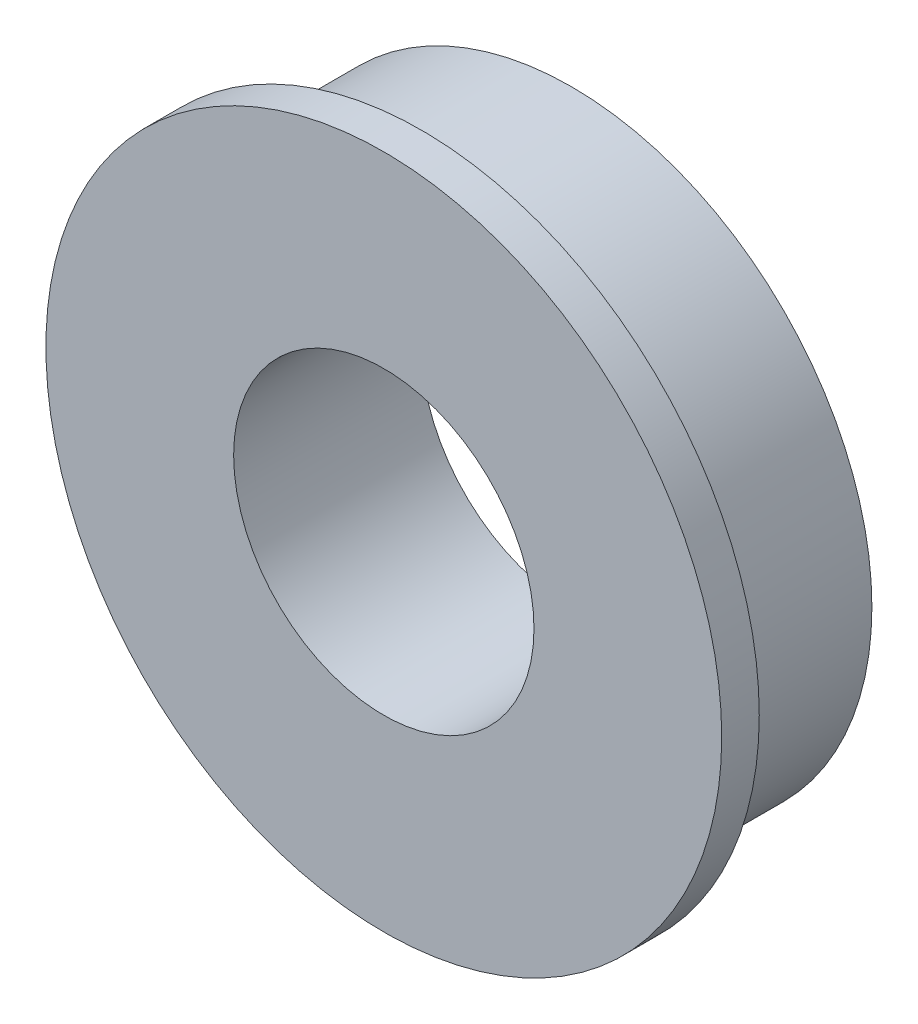
ISO-10303-21;
HEADER;
FILE_DESCRIPTION(('STEP AP214'),'2;1');
FILE_NAME('part.step','',(''),(''),'','','');
FILE_SCHEMA(('AUTOMOTIVE_DESIGN { 1 0 10303 214 1 1 1 1 }'));
ENDSEC;
DATA;
#1=APPLICATION_CONTEXT('core data for automotive mechanical design processes');
#2=APPLICATION_PROTOCOL_DEFINITION('international standard','automotive_design',2000,#1);
#3=PRODUCT_CONTEXT('',#1,'mechanical');
#4=PRODUCT('Part','Part','',(#3));
#5=PRODUCT_RELATED_PRODUCT_CATEGORY('part','',(#4));
#6=PRODUCT_DEFINITION_FORMATION('','',#4);
#7=PRODUCT_DEFINITION_CONTEXT('part definition',#1,'design');
#8=PRODUCT_DEFINITION('design','',#6,#7);
#9=PRODUCT_DEFINITION_SHAPE('','',#8);
#10=(LENGTH_UNIT() NAMED_UNIT(*) SI_UNIT(.MILLI.,.METRE.));
#11=(NAMED_UNIT(*) PLANE_ANGLE_UNIT() SI_UNIT($,.RADIAN.));
#12=(NAMED_UNIT(*) SI_UNIT($,.STERADIAN.) SOLID_ANGLE_UNIT());
#13=UNCERTAINTY_MEASURE_WITH_UNIT(LENGTH_MEASURE(1.E-05),#10,'distance_accuracy_value','');
#14=(GEOMETRIC_REPRESENTATION_CONTEXT(3) GLOBAL_UNCERTAINTY_ASSIGNED_CONTEXT((#13)) GLOBAL_UNIT_ASSIGNED_CONTEXT((#10,
#11,#12)) REPRESENTATION_CONTEXT('',''));
#15=CARTESIAN_POINT('',(0.,0.,0.));
#16=DIRECTION('',(0.,0.,1.));
#17=DIRECTION('',(1.,0.,0.));
#18=AXIS2_PLACEMENT_3D('',#15,#16,#17);
#19=CARTESIAN_POINT('',(0.,0.,5.));
#20=DIRECTION('',(0.,0.,-1.));
#21=DIRECTION('',(-1.,0.,0.));
#22=AXIS2_PLACEMENT_3D('',#19,#20,#21);
#23=CYLINDRICAL_SURFACE('',#22,8.);
#24=CARTESIAN_POINT('',(0.,0.,0.));
#25=DIRECTION('',(0.,0.,1.));
#26=DIRECTION('',(1.,0.,0.));
#27=AXIS2_PLACEMENT_3D('',#24,#25,#26);
#28=CIRCLE('',#27,8.);
#29=CARTESIAN_POINT('',(8.,0.,0.));
#30=VERTEX_POINT('',#29);
#31=EDGE_CURVE('E33',#30,#30,#28,.T.);
#32=ORIENTED_EDGE('',*,*,#31,.T.);
#33=EDGE_LOOP('',(#32));
#34=FACE_BOUND('',#33,.T.);
#35=CARTESIAN_POINT('',(0.,0.,4.));
#36=DIRECTION('',(0.,0.,1.));
#37=DIRECTION('',(1.,0.,0.));
#38=AXIS2_PLACEMENT_3D('',#35,#36,#37);
#39=CIRCLE('',#38,8.);
#40=CARTESIAN_POINT('',(8.,0.,4.));
#41=VERTEX_POINT('',#40);
#42=EDGE_CURVE('E10',#41,#41,#39,.T.);
#43=ORIENTED_EDGE('',*,*,#42,.F.);
#44=EDGE_LOOP('',(#43));
#45=FACE_BOUND('',#44,.T.);
#46=ADVANCED_FACE('F30',(#34,#45),#23,.T.);
#47=CARTESIAN_POINT('',(0.,0.,5.));
#48=DIRECTION('',(0.,0.,1.));
#49=DIRECTION('',(1.,0.,0.));
#50=AXIS2_PLACEMENT_3D('',#47,#48,#49);
#51=PLANE('',#50);
#52=CARTESIAN_POINT('',(0.,0.,5.));
#53=DIRECTION('',(0.,0.,1.));
#54=DIRECTION('',(1.,0.,0.));
#55=AXIS2_PLACEMENT_3D('',#52,#53,#54);
#56=CIRCLE('',#55,4.);
#57=CARTESIAN_POINT('',(4.,0.,5.));
#58=VERTEX_POINT('',#57);
#59=EDGE_CURVE('E41',#58,#58,#56,.T.);
#60=ORIENTED_EDGE('',*,*,#59,.F.);
#61=EDGE_LOOP('',(#60));
#62=FACE_BOUND('',#61,.T.);
#63=CARTESIAN_POINT('',(0.,0.,5.));
#64=DIRECTION('',(0.,0.,1.));
#65=DIRECTION('',(1.,0.,0.));
#66=AXIS2_PLACEMENT_3D('',#63,#64,#65);
#67=CIRCLE('',#66,9.);
#68=CARTESIAN_POINT('',(9.,0.,5.));
#69=VERTEX_POINT('',#68);
#70=EDGE_CURVE('E44',#69,#69,#67,.T.);
#71=ORIENTED_EDGE('',*,*,#70,.T.);
#72=EDGE_LOOP('',(#71));
#73=FACE_BOUND('',#72,.T.);
#74=ADVANCED_FACE('F58',(#62,#73),#51,.T.);
#75=CARTESIAN_POINT('',(0.,0.,0.));
#76=DIRECTION('',(0.,0.,1.));
#77=DIRECTION('',(1.,0.,0.));
#78=AXIS2_PLACEMENT_3D('',#75,#76,#77);
#79=PLANE('',#78);
#80=ORIENTED_EDGE('',*,*,#31,.F.);
#81=EDGE_LOOP('',(#80));
#82=FACE_BOUND('',#81,.T.);
#83=CARTESIAN_POINT('',(0.,0.,0.));
#84=DIRECTION('',(0.,0.,1.));
#85=DIRECTION('',(1.,0.,0.));
#86=AXIS2_PLACEMENT_3D('',#83,#84,#85);
#87=CIRCLE('',#86,4.);
#88=CARTESIAN_POINT('',(4.,0.,0.));
#89=VERTEX_POINT('',#88);
#90=EDGE_CURVE('E47',#89,#89,#87,.T.);
#91=ORIENTED_EDGE('',*,*,#90,.T.);
#92=EDGE_LOOP('',(#91));
#93=FACE_BOUND('',#92,.T.);
#94=ADVANCED_FACE('F76',(#82,#93),#79,.F.);
#95=CARTESIAN_POINT('',(0.,0.,5.));
#96=DIRECTION('',(0.,0.,-1.));
#97=DIRECTION('',(-1.,0.,0.));
#98=AXIS2_PLACEMENT_3D('',#95,#96,#97);
#99=CYLINDRICAL_SURFACE('',#98,4.);
#100=ORIENTED_EDGE('',*,*,#59,.T.);
#101=EDGE_LOOP('',(#100));
#102=FACE_BOUND('',#101,.T.);
#103=ORIENTED_EDGE('',*,*,#90,.F.);
#104=EDGE_LOOP('',(#103));
#105=FACE_BOUND('',#104,.T.);
#106=ADVANCED_FACE('F67',(#102,#105),#99,.F.);
#107=CARTESIAN_POINT('',(0.,0.,4.));
#108=DIRECTION('',(0.,0.,1.));
#109=DIRECTION('',(1.,0.,0.));
#110=AXIS2_PLACEMENT_3D('',#107,#108,#109);
#111=PLANE('',#110);
#112=CARTESIAN_POINT('',(0.,0.,4.));
#113=DIRECTION('',(0.,0.,1.));
#114=DIRECTION('',(1.,0.,0.));
#115=AXIS2_PLACEMENT_3D('',#112,#113,#114);
#116=CIRCLE('',#115,9.);
#117=CARTESIAN_POINT('',(9.,0.,4.));
#118=VERTEX_POINT('',#117);
#119=EDGE_CURVE('E49',#118,#118,#116,.T.);
#120=ORIENTED_EDGE('',*,*,#119,.F.);
#121=EDGE_LOOP('',(#120));
#122=FACE_BOUND('',#121,.T.);
#123=ORIENTED_EDGE('',*,*,#42,.T.);
#124=EDGE_LOOP('',(#123));
#125=FACE_BOUND('',#124,.T.);
#126=ADVANCED_FACE('F62',(#122,#125),#111,.F.);
#127=CARTESIAN_POINT('',(0.,0.,4.));
#128=DIRECTION('',(0.,0.,1.));
#129=DIRECTION('',(1.,0.,0.));
#130=AXIS2_PLACEMENT_3D('',#127,#128,#129);
#131=CYLINDRICAL_SURFACE('',#130,9.);
#132=ORIENTED_EDGE('',*,*,#119,.T.);
#133=EDGE_LOOP('',(#132));
#134=FACE_BOUND('',#133,.T.);
#135=ORIENTED_EDGE('',*,*,#70,.F.);
#136=EDGE_LOOP('',(#135));
#137=FACE_BOUND('',#136,.T.);
#138=ADVANCED_FACE('F60',(#134,#137),#131,.T.);
#139=CLOSED_SHELL('',(#46,#74,#94,#106,#126,#138));
#140=MANIFOLD_SOLID_BREP('B2',#139);
#141=ADVANCED_BREP_SHAPE_REPRESENTATION('',(#18,#140),#14);
#142=SHAPE_DEFINITION_REPRESENTATION(#9,#141);
ENDSEC;
END-ISO-10303-21;
